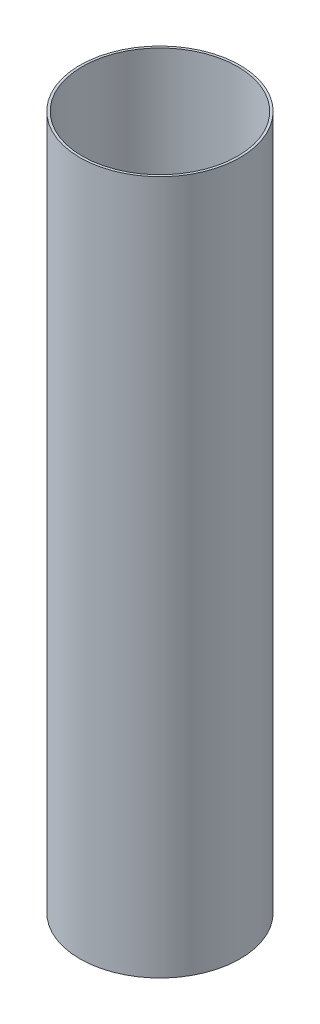
ISO-10303-21;
HEADER;
FILE_DESCRIPTION(('STEP AP214'),'2;1');
FILE_NAME('part.step','',(''),(''),'','','');
FILE_SCHEMA(('AUTOMOTIVE_DESIGN { 1 0 10303 214 1 1 1 1 }'));
ENDSEC;
DATA;
#1=APPLICATION_CONTEXT('core data for automotive mechanical design processes');
#2=APPLICATION_PROTOCOL_DEFINITION('international standard','automotive_design',2000,#1);
#3=PRODUCT_CONTEXT('',#1,'mechanical');
#4=PRODUCT('Part','Part','',(#3));
#5=PRODUCT_RELATED_PRODUCT_CATEGORY('part','',(#4));
#6=PRODUCT_DEFINITION_FORMATION('','',#4);
#7=PRODUCT_DEFINITION_CONTEXT('part definition',#1,'design');
#8=PRODUCT_DEFINITION('design','',#6,#7);
#9=PRODUCT_DEFINITION_SHAPE('','',#8);
#10=(LENGTH_UNIT() NAMED_UNIT(*) SI_UNIT(.MILLI.,.METRE.));
#11=(NAMED_UNIT(*) PLANE_ANGLE_UNIT() SI_UNIT($,.RADIAN.));
#12=(NAMED_UNIT(*) SI_UNIT($,.STERADIAN.) SOLID_ANGLE_UNIT());
#13=UNCERTAINTY_MEASURE_WITH_UNIT(LENGTH_MEASURE(1.E-05),#10,'distance_accuracy_value','');
#14=(GEOMETRIC_REPRESENTATION_CONTEXT(3) GLOBAL_UNCERTAINTY_ASSIGNED_CONTEXT((#13)) GLOBAL_UNIT_ASSIGNED_CONTEXT((#10,
#11,#12)) REPRESENTATION_CONTEXT('',''));
#15=CARTESIAN_POINT('',(0.,0.,0.));
#16=DIRECTION('',(0.,0.,1.));
#17=DIRECTION('',(1.,0.,0.));
#18=AXIS2_PLACEMENT_3D('',#15,#16,#17);
#19=CARTESIAN_POINT('',(0.,-350.,0.));
#20=DIRECTION('',(0.,1.,0.));
#21=DIRECTION('',(0.,0.,1.));
#22=AXIS2_PLACEMENT_3D('',#19,#20,#21);
#23=CYLINDRICAL_SURFACE('',#22,80.75);
#24=CARTESIAN_POINT('',(0.,-350.,0.));
#25=DIRECTION('',(0.,1.,0.));
#26=DIRECTION('',(0.,0.,1.));
#27=AXIS2_PLACEMENT_3D('',#24,#25,#26);
#28=CIRCLE('',#27,80.75);
#29=CARTESIAN_POINT('',(0.,-350.,80.75));
#30=VERTEX_POINT('',#29);
#31=EDGE_CURVE('E10',#30,#30,#28,.T.);
#32=ORIENTED_EDGE('',*,*,#31,.T.);
#33=EDGE_LOOP('',(#32));
#34=FACE_BOUND('',#33,.T.);
#35=CARTESIAN_POINT('',(0.,350.,0.));
#36=DIRECTION('',(0.,1.,0.));
#37=DIRECTION('',(0.,0.,1.));
#38=AXIS2_PLACEMENT_3D('',#35,#36,#37);
#39=CIRCLE('',#38,80.75);
#40=CARTESIAN_POINT('',(0.,350.,80.75));
#41=VERTEX_POINT('',#40);
#42=EDGE_CURVE('E44',#41,#41,#39,.T.);
#43=ORIENTED_EDGE('',*,*,#42,.F.);
#44=EDGE_LOOP('',(#43));
#45=FACE_BOUND('',#44,.T.);
#46=ADVANCED_FACE('F34',(#34,#45),#23,.T.);
#47=CARTESIAN_POINT('',(0.,-350.,0.));
#48=DIRECTION('',(0.,1.,0.));
#49=DIRECTION('',(0.,0.,1.));
#50=AXIS2_PLACEMENT_3D('',#47,#48,#49);
#51=PLANE('',#50);
#52=CARTESIAN_POINT('',(0.,-350.,0.));
#53=DIRECTION('',(0.,1.,0.));
#54=DIRECTION('',(0.,0.,1.));
#55=AXIS2_PLACEMENT_3D('',#52,#53,#54);
#56=CIRCLE('',#55,78.35);
#57=CARTESIAN_POINT('',(0.,-350.,78.35));
#58=VERTEX_POINT('',#57);
#59=EDGE_CURVE('E40',#58,#58,#56,.T.);
#60=ORIENTED_EDGE('',*,*,#59,.T.);
#61=EDGE_LOOP('',(#60));
#62=FACE_BOUND('',#61,.T.);
#63=ORIENTED_EDGE('',*,*,#31,.F.);
#64=EDGE_LOOP('',(#63));
#65=FACE_BOUND('',#64,.T.);
#66=ADVANCED_FACE('F63',(#62,#65),#51,.F.);
#67=CARTESIAN_POINT('',(0.,-350.,0.));
#68=DIRECTION('',(0.,1.,0.));
#69=DIRECTION('',(0.,0.,1.));
#70=AXIS2_PLACEMENT_3D('',#67,#68,#69);
#71=CYLINDRICAL_SURFACE('',#70,78.35);
#72=ORIENTED_EDGE('',*,*,#59,.F.);
#73=EDGE_LOOP('',(#72));
#74=FACE_BOUND('',#73,.T.);
#75=CARTESIAN_POINT('',(0.,350.,0.));
#76=DIRECTION('',(0.,1.,0.));
#77=DIRECTION('',(0.,0.,1.));
#78=AXIS2_PLACEMENT_3D('',#75,#76,#77);
#79=CIRCLE('',#78,78.35);
#80=CARTESIAN_POINT('',(0.,350.,78.35));
#81=VERTEX_POINT('',#80);
#82=EDGE_CURVE('E48',#81,#81,#79,.T.);
#83=ORIENTED_EDGE('',*,*,#82,.T.);
#84=EDGE_LOOP('',(#83));
#85=FACE_BOUND('',#84,.T.);
#86=ADVANCED_FACE('F54',(#74,#85),#71,.F.);
#87=CARTESIAN_POINT('',(0.,350.,0.));
#88=DIRECTION('',(0.,1.,0.));
#89=DIRECTION('',(0.,0.,1.));
#90=AXIS2_PLACEMENT_3D('',#87,#88,#89);
#91=PLANE('',#90);
#92=ORIENTED_EDGE('',*,*,#42,.T.);
#93=EDGE_LOOP('',(#92));
#94=FACE_BOUND('',#93,.T.);
#95=ORIENTED_EDGE('',*,*,#82,.F.);
#96=EDGE_LOOP('',(#95));
#97=FACE_BOUND('',#96,.T.);
#98=ADVANCED_FACE('F56',(#94,#97),#91,.T.);
#99=CLOSED_SHELL('',(#46,#66,#86,#98));
#100=MANIFOLD_SOLID_BREP('B2',#99);
#101=ADVANCED_BREP_SHAPE_REPRESENTATION('',(#18,#100),#14);
#102=SHAPE_DEFINITION_REPRESENTATION(#9,#101);
ENDSEC;
END-ISO-10303-21;
